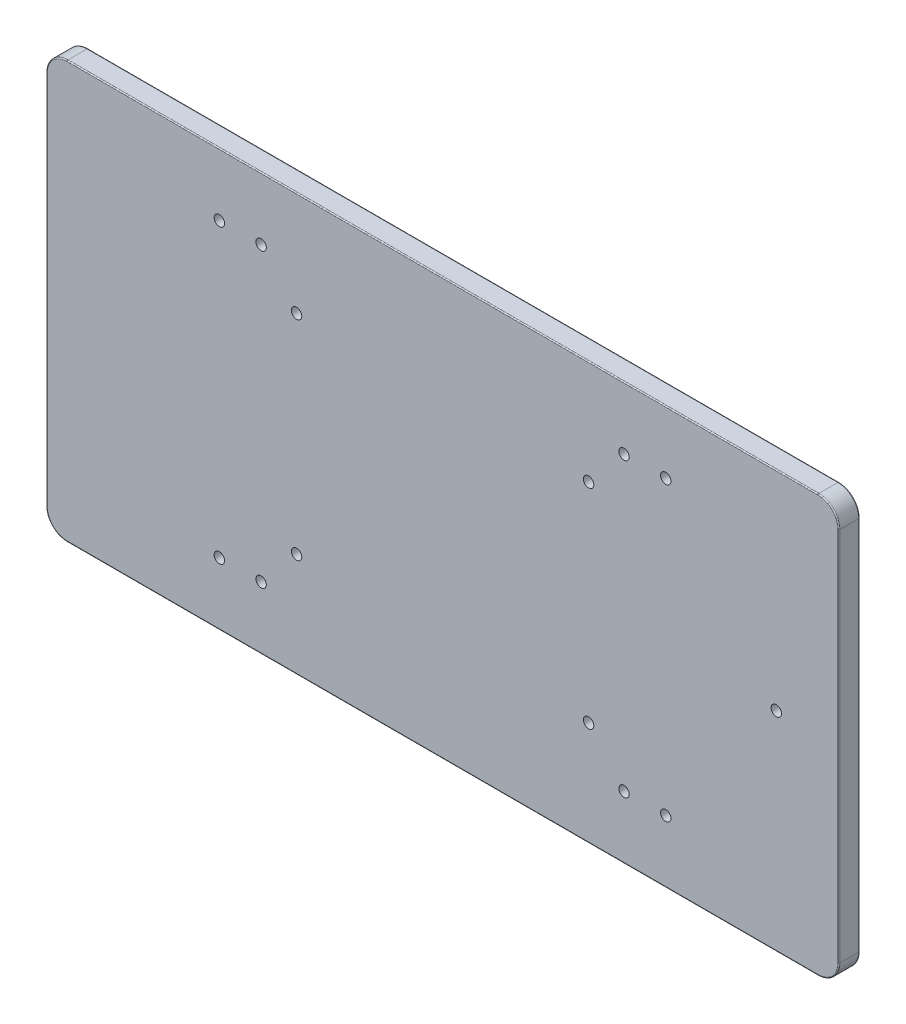
ISO-10303-21;
HEADER;
FILE_DESCRIPTION(('STEP AP214'),'2;1');
FILE_NAME('part.step','',(''),(''),'','','');
FILE_SCHEMA(('AUTOMOTIVE_DESIGN { 1 0 10303 214 1 1 1 1 }'));
ENDSEC;
DATA;
#1=APPLICATION_CONTEXT('core data for automotive mechanical design processes');
#2=APPLICATION_PROTOCOL_DEFINITION('international standard','automotive_design',2000,#1);
#3=PRODUCT_CONTEXT('',#1,'mechanical');
#4=PRODUCT('Part','Part','',(#3));
#5=PRODUCT_RELATED_PRODUCT_CATEGORY('part','',(#4));
#6=PRODUCT_DEFINITION_FORMATION('','',#4);
#7=PRODUCT_DEFINITION_CONTEXT('part definition',#1,'design');
#8=PRODUCT_DEFINITION('design','',#6,#7);
#9=PRODUCT_DEFINITION_SHAPE('','',#8);
#10=(LENGTH_UNIT() NAMED_UNIT(*) SI_UNIT(.MILLI.,.METRE.));
#11=(NAMED_UNIT(*) PLANE_ANGLE_UNIT() SI_UNIT($,.RADIAN.));
#12=(NAMED_UNIT(*) SI_UNIT($,.STERADIAN.) SOLID_ANGLE_UNIT());
#13=UNCERTAINTY_MEASURE_WITH_UNIT(LENGTH_MEASURE(1.E-05),#10,'distance_accuracy_value','');
#14=(GEOMETRIC_REPRESENTATION_CONTEXT(3) GLOBAL_UNCERTAINTY_ASSIGNED_CONTEXT((#13)) GLOBAL_UNIT_ASSIGNED_CONTEXT((#10,
#11,#12)) REPRESENTATION_CONTEXT('',''));
#15=CARTESIAN_POINT('',(0.,0.,0.));
#16=DIRECTION('',(0.,0.,1.));
#17=DIRECTION('',(1.,0.,0.));
#18=AXIS2_PLACEMENT_3D('',#15,#16,#17);
#19=CARTESIAN_POINT('',(0.,0.,5.));
#20=DIRECTION('',(0.,0.,-1.));
#21=DIRECTION('',(-1.,0.,0.));
#22=AXIS2_PLACEMENT_3D('',#19,#20,#21);
#23=PLANE('',#22);
#24=DIRECTION('',(0.,-1.,0.));
#25=VECTOR('',#24,1.);
#26=CARTESIAN_POINT('',(-94.75,0.,5.));
#27=LINE('',#26,#25);
#28=CARTESIAN_POINT('',(-94.75,45.,5.));
#29=VERTEX_POINT('',#28);
#30=CARTESIAN_POINT('',(-94.75,-45.,5.));
#31=VERTEX_POINT('',#30);
#32=EDGE_CURVE('E54',#29,#31,#27,.T.);
#33=ORIENTED_EDGE('',*,*,#32,.T.);
#34=CARTESIAN_POINT('',(-90.,-45.,5.));
#35=DIRECTION('',(0.,0.,-1.));
#36=DIRECTION('',(-1.,0.,0.));
#37=AXIS2_PLACEMENT_3D('',#34,#35,#36);
#38=CIRCLE('',#37,4.75);
#39=CARTESIAN_POINT('',(-90.,-49.75,5.));
#40=VERTEX_POINT('',#39);
#41=EDGE_CURVE('E236',#31,#40,#38,.F.);
#42=ORIENTED_EDGE('',*,*,#41,.T.);
#43=DIRECTION('',(1.,0.,0.));
#44=VECTOR('',#43,1.);
#45=CARTESIAN_POINT('',(0.,-49.75,5.));
#46=LINE('',#45,#44);
#47=CARTESIAN_POINT('',(90.,-49.75,5.));
#48=VERTEX_POINT('',#47);
#49=EDGE_CURVE('E224',#40,#48,#46,.T.);
#50=ORIENTED_EDGE('',*,*,#49,.T.);
#51=CARTESIAN_POINT('',(90.,-45.,5.));
#52=DIRECTION('',(0.,0.,-1.));
#53=DIRECTION('',(-1.,0.,0.));
#54=AXIS2_PLACEMENT_3D('',#51,#52,#53);
#55=CIRCLE('',#54,4.75);
#56=CARTESIAN_POINT('',(94.75,-45.,5.));
#57=VERTEX_POINT('',#56);
#58=EDGE_CURVE('E226',#48,#57,#55,.F.);
#59=ORIENTED_EDGE('',*,*,#58,.T.);
#60=DIRECTION('',(0.,1.,0.));
#61=VECTOR('',#60,1.);
#62=CARTESIAN_POINT('',(94.75,0.,5.));
#63=LINE('',#62,#61);
#64=CARTESIAN_POINT('',(94.75,45.,5.));
#65=VERTEX_POINT('',#64);
#66=EDGE_CURVE('E228',#57,#65,#63,.T.);
#67=ORIENTED_EDGE('',*,*,#66,.T.);
#68=CARTESIAN_POINT('',(90.,45.,5.));
#69=DIRECTION('',(0.,0.,-1.));
#70=DIRECTION('',(-1.,0.,0.));
#71=AXIS2_PLACEMENT_3D('',#68,#69,#70);
#72=CIRCLE('',#71,4.75);
#73=CARTESIAN_POINT('',(90.,49.75,5.));
#74=VERTEX_POINT('',#73);
#75=EDGE_CURVE('E230',#65,#74,#72,.F.);
#76=ORIENTED_EDGE('',*,*,#75,.T.);
#77=DIRECTION('',(-1.,0.,0.));
#78=VECTOR('',#77,1.);
#79=CARTESIAN_POINT('',(0.,49.75,5.));
#80=LINE('',#79,#78);
#81=CARTESIAN_POINT('',(-90.,49.75,5.));
#82=VERTEX_POINT('',#81);
#83=EDGE_CURVE('E232',#74,#82,#80,.T.);
#84=ORIENTED_EDGE('',*,*,#83,.T.);
#85=CARTESIAN_POINT('',(-90.,45.,5.));
#86=DIRECTION('',(0.,0.,-1.));
#87=DIRECTION('',(-1.,0.,0.));
#88=AXIS2_PLACEMENT_3D('',#85,#86,#87);
#89=CIRCLE('',#88,4.75);
#90=EDGE_CURVE('E59',#82,#29,#89,.F.);
#91=ORIENTED_EDGE('',*,*,#90,.T.);
#92=EDGE_LOOP('',(#33,#42,#50,#59,#67,#76,#84,#91));
#93=FACE_BOUND('',#92,.T.);
#94=CARTESIAN_POINT('',(-43.5,-35.,5.));
#95=DIRECTION('',(0.,0.,1.));
#96=DIRECTION('',(1.,0.,0.));
#97=AXIS2_PLACEMENT_3D('',#94,#95,#96);
#98=CIRCLE('',#97,1.25);
#99=CARTESIAN_POINT('',(-42.25,-35.,5.));
#100=VERTEX_POINT('',#99);
#101=EDGE_CURVE('E359',#100,#100,#98,.T.);
#102=ORIENTED_EDGE('',*,*,#101,.F.);
#103=EDGE_LOOP('',(#102));
#104=FACE_BOUND('',#103,.T.);
#105=CARTESIAN_POINT('',(-53.5,-35.,5.));
#106=DIRECTION('',(0.,0.,1.));
#107=DIRECTION('',(1.,0.,0.));
#108=AXIS2_PLACEMENT_3D('',#105,#106,#107);
#109=CIRCLE('',#108,1.25);
#110=CARTESIAN_POINT('',(-52.25,-35.,5.));
#111=VERTEX_POINT('',#110);
#112=EDGE_CURVE('E366',#111,#111,#109,.T.);
#113=ORIENTED_EDGE('',*,*,#112,.F.);
#114=EDGE_LOOP('',(#113));
#115=FACE_BOUND('',#114,.T.);
#116=CARTESIAN_POINT('',(-35.,25.,5.));
#117=DIRECTION('',(0.,0.,1.));
#118=DIRECTION('',(1.,0.,0.));
#119=AXIS2_PLACEMENT_3D('',#116,#117,#118);
#120=CIRCLE('',#119,1.25);
#121=CARTESIAN_POINT('',(-33.75,25.,5.));
#122=VERTEX_POINT('',#121);
#123=EDGE_CURVE('E371',#122,#122,#120,.T.);
#124=ORIENTED_EDGE('',*,*,#123,.F.);
#125=EDGE_LOOP('',(#124));
#126=FACE_BOUND('',#125,.T.);
#127=CARTESIAN_POINT('',(35.,25.,5.));
#128=DIRECTION('',(0.,0.,1.));
#129=DIRECTION('',(1.,0.,0.));
#130=AXIS2_PLACEMENT_3D('',#127,#128,#129);
#131=CIRCLE('',#130,1.25);
#132=CARTESIAN_POINT('',(36.25,25.,5.));
#133=VERTEX_POINT('',#132);
#134=EDGE_CURVE('E377',#133,#133,#131,.T.);
#135=ORIENTED_EDGE('',*,*,#134,.F.);
#136=EDGE_LOOP('',(#135));
#137=FACE_BOUND('',#136,.T.);
#138=CARTESIAN_POINT('',(35.,-25.,5.));
#139=DIRECTION('',(0.,0.,1.));
#140=DIRECTION('',(1.,0.,0.));
#141=AXIS2_PLACEMENT_3D('',#138,#139,#140);
#142=CIRCLE('',#141,1.25);
#143=CARTESIAN_POINT('',(36.25,-25.,5.));
#144=VERTEX_POINT('',#143);
#145=EDGE_CURVE('E383',#144,#144,#142,.T.);
#146=ORIENTED_EDGE('',*,*,#145,.F.);
#147=EDGE_LOOP('',(#146));
#148=FACE_BOUND('',#147,.T.);
#149=CARTESIAN_POINT('',(-35.,-25.,5.));
#150=DIRECTION('',(0.,0.,1.));
#151=DIRECTION('',(1.,0.,0.));
#152=AXIS2_PLACEMENT_3D('',#149,#150,#151);
#153=CIRCLE('',#152,1.25);
#154=CARTESIAN_POINT('',(-33.75,-25.,5.));
#155=VERTEX_POINT('',#154);
#156=EDGE_CURVE('E389',#155,#155,#153,.T.);
#157=ORIENTED_EDGE('',*,*,#156,.F.);
#158=EDGE_LOOP('',(#157));
#159=FACE_BOUND('',#158,.T.);
#160=CARTESIAN_POINT('',(43.4999999999999,-35.0000000000001,5.));
#161=DIRECTION('',(0.,0.,1.));
#162=DIRECTION('',(-1.,0.,0.));
#163=AXIS2_PLACEMENT_3D('',#160,#161,#162);
#164=CIRCLE('',#163,1.24999999999998);
#165=CARTESIAN_POINT('',(42.2499999999999,-35.0000000000001,5.));
#166=VERTEX_POINT('',#165);
#167=EDGE_CURVE('E395',#166,#166,#164,.T.);
#168=ORIENTED_EDGE('',*,*,#167,.F.);
#169=EDGE_LOOP('',(#168));
#170=FACE_BOUND('',#169,.T.);
#171=CARTESIAN_POINT('',(53.4999999999999,-35.0000000000001,5.));
#172=DIRECTION('',(0.,0.,1.));
#173=DIRECTION('',(-1.,0.,0.));
#174=AXIS2_PLACEMENT_3D('',#171,#172,#173);
#175=CIRCLE('',#174,1.24999999999999);
#176=CARTESIAN_POINT('',(52.2499999999999,-35.0000000000001,5.));
#177=VERTEX_POINT('',#176);
#178=EDGE_CURVE('E401',#177,#177,#175,.T.);
#179=ORIENTED_EDGE('',*,*,#178,.F.);
#180=EDGE_LOOP('',(#179));
#181=FACE_BOUND('',#180,.T.);
#182=CARTESIAN_POINT('',(53.4999999999999,35.0000000000001,5.));
#183=DIRECTION('',(0.,0.,1.));
#184=DIRECTION('',(1.,0.,0.));
#185=AXIS2_PLACEMENT_3D('',#182,#183,#184);
#186=CIRCLE('',#185,1.24999999999999);
#187=CARTESIAN_POINT('',(54.7499999999999,35.0000000000001,5.));
#188=VERTEX_POINT('',#187);
#189=EDGE_CURVE('E407',#188,#188,#186,.T.);
#190=ORIENTED_EDGE('',*,*,#189,.F.);
#191=EDGE_LOOP('',(#190));
#192=FACE_BOUND('',#191,.T.);
#193=CARTESIAN_POINT('',(43.4999999999999,35.0000000000001,5.));
#194=DIRECTION('',(0.,0.,1.));
#195=DIRECTION('',(1.,0.,0.));
#196=AXIS2_PLACEMENT_3D('',#193,#194,#195);
#197=CIRCLE('',#196,1.24999999999998);
#198=CARTESIAN_POINT('',(44.7499999999999,35.0000000000001,5.));
#199=VERTEX_POINT('',#198);
#200=EDGE_CURVE('E413',#199,#199,#197,.T.);
#201=ORIENTED_EDGE('',*,*,#200,.F.);
#202=EDGE_LOOP('',(#201));
#203=FACE_BOUND('',#202,.T.);
#204=CARTESIAN_POINT('',(-53.4999999999999,35.0000000000001,5.));
#205=DIRECTION('',(0.,0.,1.));
#206=DIRECTION('',(-1.,0.,0.));
#207=AXIS2_PLACEMENT_3D('',#204,#205,#206);
#208=CIRCLE('',#207,1.24999999999998);
#209=CARTESIAN_POINT('',(-54.7499999999999,35.0000000000001,5.));
#210=VERTEX_POINT('',#209);
#211=EDGE_CURVE('E419',#210,#210,#208,.T.);
#212=ORIENTED_EDGE('',*,*,#211,.F.);
#213=EDGE_LOOP('',(#212));
#214=FACE_BOUND('',#213,.T.);
#215=CARTESIAN_POINT('',(-43.4999999999999,35.0000000000001,5.));
#216=DIRECTION('',(0.,0.,1.));
#217=DIRECTION('',(-1.,0.,0.));
#218=AXIS2_PLACEMENT_3D('',#215,#216,#217);
#219=CIRCLE('',#218,1.24999999999997);
#220=CARTESIAN_POINT('',(-44.7499999999999,35.0000000000001,5.));
#221=VERTEX_POINT('',#220);
#222=EDGE_CURVE('E425',#221,#221,#219,.T.);
#223=ORIENTED_EDGE('',*,*,#222,.F.);
#224=EDGE_LOOP('',(#223));
#225=FACE_BOUND('',#224,.T.);
#226=CARTESIAN_POINT('',(80.,0.,5.));
#227=DIRECTION('',(0.,0.,1.));
#228=DIRECTION('',(1.,0.,0.));
#229=AXIS2_PLACEMENT_3D('',#226,#227,#228);
#230=CIRCLE('',#229,1.25);
#231=CARTESIAN_POINT('',(81.25,0.,5.));
#232=VERTEX_POINT('',#231);
#233=EDGE_CURVE('E431',#232,#232,#230,.T.);
#234=ORIENTED_EDGE('',*,*,#233,.F.);
#235=EDGE_LOOP('',(#234));
#236=FACE_BOUND('',#235,.T.);
#237=ADVANCED_FACE('F37',(#93,#104,#115,#126,#137,#148,#159,#170,#181,#192,#203,#214,#225,#236),
#23,.F.);
#238=CARTESIAN_POINT('',(0.,0.,0.));
#239=DIRECTION('',(0.,0.,-1.));
#240=DIRECTION('',(-1.,0.,0.));
#241=AXIS2_PLACEMENT_3D('',#238,#239,#240);
#242=PLANE('',#241);
#243=DIRECTION('',(1.,0.,0.));
#244=VECTOR('',#243,1.);
#245=CARTESIAN_POINT('',(-90.,-49.75,0.));
#246=LINE('',#245,#244);
#247=CARTESIAN_POINT('',(90.,-49.75,0.));
#248=VERTEX_POINT('',#247);
#249=CARTESIAN_POINT('',(-90.,-49.75,0.));
#250=VERTEX_POINT('',#249);
#251=EDGE_CURVE('E156',#248,#250,#246,.F.);
#252=ORIENTED_EDGE('',*,*,#251,.T.);
#253=CARTESIAN_POINT('',(-90.,-45.,0.));
#254=DIRECTION('',(0.,0.,-1.));
#255=DIRECTION('',(-1.,0.,0.));
#256=AXIS2_PLACEMENT_3D('',#253,#254,#255);
#257=CIRCLE('',#256,4.75);
#258=CARTESIAN_POINT('',(-94.75,-45.,0.));
#259=VERTEX_POINT('',#258);
#260=EDGE_CURVE('E193',#250,#259,#257,.T.);
#261=ORIENTED_EDGE('',*,*,#260,.T.);
#262=DIRECTION('',(0.,-1.,0.));
#263=VECTOR('',#262,1.);
#264=CARTESIAN_POINT('',(-94.75,45.,0.));
#265=LINE('',#264,#263);
#266=CARTESIAN_POINT('',(-94.75,45.,0.));
#267=VERTEX_POINT('',#266);
#268=EDGE_CURVE('E191',#259,#267,#265,.F.);
#269=ORIENTED_EDGE('',*,*,#268,.T.);
#270=CARTESIAN_POINT('',(-90.,45.,0.));
#271=DIRECTION('',(0.,0.,-1.));
#272=DIRECTION('',(-1.,0.,0.));
#273=AXIS2_PLACEMENT_3D('',#270,#271,#272);
#274=CIRCLE('',#273,4.75);
#275=CARTESIAN_POINT('',(-90.,49.75,0.));
#276=VERTEX_POINT('',#275);
#277=EDGE_CURVE('E189',#267,#276,#274,.T.);
#278=ORIENTED_EDGE('',*,*,#277,.T.);
#279=DIRECTION('',(-1.,0.,0.));
#280=VECTOR('',#279,1.);
#281=CARTESIAN_POINT('',(90.,49.75,0.));
#282=LINE('',#281,#280);
#283=CARTESIAN_POINT('',(90.,49.75,0.));
#284=VERTEX_POINT('',#283);
#285=EDGE_CURVE('E187',#276,#284,#282,.F.);
#286=ORIENTED_EDGE('',*,*,#285,.T.);
#287=CARTESIAN_POINT('',(90.,45.,0.));
#288=DIRECTION('',(0.,0.,-1.));
#289=DIRECTION('',(-1.,0.,0.));
#290=AXIS2_PLACEMENT_3D('',#287,#288,#289);
#291=CIRCLE('',#290,4.75);
#292=CARTESIAN_POINT('',(94.75,45.,0.));
#293=VERTEX_POINT('',#292);
#294=EDGE_CURVE('E185',#284,#293,#291,.T.);
#295=ORIENTED_EDGE('',*,*,#294,.T.);
#296=DIRECTION('',(0.,1.,0.));
#297=VECTOR('',#296,1.);
#298=CARTESIAN_POINT('',(94.75,-45.,0.));
#299=LINE('',#298,#297);
#300=CARTESIAN_POINT('',(94.75,-45.,0.));
#301=VERTEX_POINT('',#300);
#302=EDGE_CURVE('E159',#293,#301,#299,.F.);
#303=ORIENTED_EDGE('',*,*,#302,.T.);
#304=CARTESIAN_POINT('',(90.,-45.,0.));
#305=DIRECTION('',(0.,0.,-1.));
#306=DIRECTION('',(-1.,0.,0.));
#307=AXIS2_PLACEMENT_3D('',#304,#305,#306);
#308=CIRCLE('',#307,4.75);
#309=EDGE_CURVE('E150',#301,#248,#308,.T.);
#310=ORIENTED_EDGE('',*,*,#309,.T.);
#311=EDGE_LOOP('',(#252,#261,#269,#278,#286,#295,#303,#310));
#312=FACE_BOUND('',#311,.T.);
#313=CARTESIAN_POINT('',(-43.4999999999999,35.0000000000001,0.));
#314=DIRECTION('',(0.,0.,1.));
#315=DIRECTION('',(-1.,0.,0.));
#316=AXIS2_PLACEMENT_3D('',#313,#314,#315);
#317=CIRCLE('',#316,1.24999999999997);
#318=CARTESIAN_POINT('',(-44.7499999999999,35.0000000000001,0.));
#319=VERTEX_POINT('',#318);
#320=EDGE_CURVE('E428',#319,#319,#317,.T.);
#321=ORIENTED_EDGE('',*,*,#320,.T.);
#322=EDGE_LOOP('',(#321));
#323=FACE_BOUND('',#322,.T.);
#324=CARTESIAN_POINT('',(43.4999999999999,35.0000000000001,0.));
#325=DIRECTION('',(0.,0.,1.));
#326=DIRECTION('',(1.,0.,0.));
#327=AXIS2_PLACEMENT_3D('',#324,#325,#326);
#328=CIRCLE('',#327,1.24999999999998);
#329=CARTESIAN_POINT('',(44.7499999999999,35.0000000000001,0.));
#330=VERTEX_POINT('',#329);
#331=EDGE_CURVE('E416',#330,#330,#328,.T.);
#332=ORIENTED_EDGE('',*,*,#331,.T.);
#333=EDGE_LOOP('',(#332));
#334=FACE_BOUND('',#333,.T.);
#335=CARTESIAN_POINT('',(53.4999999999999,-35.0000000000001,0.));
#336=DIRECTION('',(0.,0.,1.));
#337=DIRECTION('',(-1.,0.,0.));
#338=AXIS2_PLACEMENT_3D('',#335,#336,#337);
#339=CIRCLE('',#338,1.24999999999999);
#340=CARTESIAN_POINT('',(52.2499999999999,-35.0000000000001,0.));
#341=VERTEX_POINT('',#340);
#342=EDGE_CURVE('E404',#341,#341,#339,.T.);
#343=ORIENTED_EDGE('',*,*,#342,.T.);
#344=EDGE_LOOP('',(#343));
#345=FACE_BOUND('',#344,.T.);
#346=CARTESIAN_POINT('',(-35.,-25.,0.));
#347=DIRECTION('',(0.,0.,1.));
#348=DIRECTION('',(1.,0.,0.));
#349=AXIS2_PLACEMENT_3D('',#346,#347,#348);
#350=CIRCLE('',#349,1.25);
#351=CARTESIAN_POINT('',(-33.75,-25.,0.));
#352=VERTEX_POINT('',#351);
#353=EDGE_CURVE('E392',#352,#352,#350,.T.);
#354=ORIENTED_EDGE('',*,*,#353,.T.);
#355=EDGE_LOOP('',(#354));
#356=FACE_BOUND('',#355,.T.);
#357=CARTESIAN_POINT('',(35.,25.,0.));
#358=DIRECTION('',(0.,0.,1.));
#359=DIRECTION('',(1.,0.,0.));
#360=AXIS2_PLACEMENT_3D('',#357,#358,#359);
#361=CIRCLE('',#360,1.25);
#362=CARTESIAN_POINT('',(36.25,25.,0.));
#363=VERTEX_POINT('',#362);
#364=EDGE_CURVE('E380',#363,#363,#361,.T.);
#365=ORIENTED_EDGE('',*,*,#364,.T.);
#366=EDGE_LOOP('',(#365));
#367=FACE_BOUND('',#366,.T.);
#368=CARTESIAN_POINT('',(-53.5,-35.,0.));
#369=DIRECTION('',(0.,0.,1.));
#370=DIRECTION('',(1.,0.,0.));
#371=AXIS2_PLACEMENT_3D('',#368,#369,#370);
#372=CIRCLE('',#371,1.25);
#373=CARTESIAN_POINT('',(-52.25,-35.,0.));
#374=VERTEX_POINT('',#373);
#375=EDGE_CURVE('E368',#374,#374,#372,.T.);
#376=ORIENTED_EDGE('',*,*,#375,.T.);
#377=EDGE_LOOP('',(#376));
#378=FACE_BOUND('',#377,.T.);
#379=CARTESIAN_POINT('',(-43.5,-35.,0.));
#380=DIRECTION('',(0.,0.,1.));
#381=DIRECTION('',(1.,0.,0.));
#382=AXIS2_PLACEMENT_3D('',#379,#380,#381);
#383=CIRCLE('',#382,1.25);
#384=CARTESIAN_POINT('',(-42.25,-35.,0.));
#385=VERTEX_POINT('',#384);
#386=EDGE_CURVE('E362',#385,#385,#383,.T.);
#387=ORIENTED_EDGE('',*,*,#386,.T.);
#388=EDGE_LOOP('',(#387));
#389=FACE_BOUND('',#388,.T.);
#390=CARTESIAN_POINT('',(-35.,25.,0.));
#391=DIRECTION('',(0.,0.,1.));
#392=DIRECTION('',(1.,0.,0.));
#393=AXIS2_PLACEMENT_3D('',#390,#391,#392);
#394=CIRCLE('',#393,1.25);
#395=CARTESIAN_POINT('',(-33.75,25.,0.));
#396=VERTEX_POINT('',#395);
#397=EDGE_CURVE('E374',#396,#396,#394,.T.);
#398=ORIENTED_EDGE('',*,*,#397,.T.);
#399=EDGE_LOOP('',(#398));
#400=FACE_BOUND('',#399,.T.);
#401=CARTESIAN_POINT('',(35.,-25.,0.));
#402=DIRECTION('',(0.,0.,1.));
#403=DIRECTION('',(1.,0.,0.));
#404=AXIS2_PLACEMENT_3D('',#401,#402,#403);
#405=CIRCLE('',#404,1.25);
#406=CARTESIAN_POINT('',(36.25,-25.,0.));
#407=VERTEX_POINT('',#406);
#408=EDGE_CURVE('E386',#407,#407,#405,.T.);
#409=ORIENTED_EDGE('',*,*,#408,.T.);
#410=EDGE_LOOP('',(#409));
#411=FACE_BOUND('',#410,.T.);
#412=CARTESIAN_POINT('',(43.4999999999999,-35.0000000000001,0.));
#413=DIRECTION('',(0.,0.,1.));
#414=DIRECTION('',(-1.,0.,0.));
#415=AXIS2_PLACEMENT_3D('',#412,#413,#414);
#416=CIRCLE('',#415,1.24999999999998);
#417=CARTESIAN_POINT('',(42.2499999999999,-35.0000000000001,0.));
#418=VERTEX_POINT('',#417);
#419=EDGE_CURVE('E398',#418,#418,#416,.T.);
#420=ORIENTED_EDGE('',*,*,#419,.T.);
#421=EDGE_LOOP('',(#420));
#422=FACE_BOUND('',#421,.T.);
#423=CARTESIAN_POINT('',(53.4999999999999,35.0000000000001,0.));
#424=DIRECTION('',(0.,0.,1.));
#425=DIRECTION('',(1.,0.,0.));
#426=AXIS2_PLACEMENT_3D('',#423,#424,#425);
#427=CIRCLE('',#426,1.24999999999999);
#428=CARTESIAN_POINT('',(54.7499999999999,35.0000000000001,0.));
#429=VERTEX_POINT('',#428);
#430=EDGE_CURVE('E410',#429,#429,#427,.T.);
#431=ORIENTED_EDGE('',*,*,#430,.T.);
#432=EDGE_LOOP('',(#431));
#433=FACE_BOUND('',#432,.T.);
#434=CARTESIAN_POINT('',(-53.4999999999999,35.0000000000001,0.));
#435=DIRECTION('',(0.,0.,1.));
#436=DIRECTION('',(-1.,0.,0.));
#437=AXIS2_PLACEMENT_3D('',#434,#435,#436);
#438=CIRCLE('',#437,1.24999999999998);
#439=CARTESIAN_POINT('',(-54.7499999999999,35.0000000000001,0.));
#440=VERTEX_POINT('',#439);
#441=EDGE_CURVE('E422',#440,#440,#438,.T.);
#442=ORIENTED_EDGE('',*,*,#441,.T.);
#443=EDGE_LOOP('',(#442));
#444=FACE_BOUND('',#443,.T.);
#445=CARTESIAN_POINT('',(80.,0.,0.));
#446=DIRECTION('',(0.,0.,1.));
#447=DIRECTION('',(1.,0.,0.));
#448=AXIS2_PLACEMENT_3D('',#445,#446,#447);
#449=CIRCLE('',#448,1.25);
#450=CARTESIAN_POINT('',(81.25,0.,0.));
#451=VERTEX_POINT('',#450);
#452=EDGE_CURVE('E254',#451,#451,#449,.T.);
#453=ORIENTED_EDGE('',*,*,#452,.T.);
#454=EDGE_LOOP('',(#453));
#455=FACE_BOUND('',#454,.T.);
#456=ADVANCED_FACE('F152',(#312,#323,#334,#345,#356,#367,#378,#389,#400,#411,#422,#433,#444,
#455),#242,.T.);
#457=CARTESIAN_POINT('',(-95.,50.,5.));
#458=DIRECTION('',(1.,0.,0.));
#459=DIRECTION('',(0.,1.,0.));
#460=AXIS2_PLACEMENT_3D('',#457,#458,#459);
#461=PLANE('',#460);
#462=DIRECTION('',(0.,0.,-1.));
#463=VECTOR('',#462,1.);
#464=CARTESIAN_POINT('',(-95.,45.,5.));
#465=LINE('',#464,#463);
#466=CARTESIAN_POINT('',(-95.,45.,4.75));
#467=VERTEX_POINT('',#466);
#468=CARTESIAN_POINT('',(-95.,45.,0.25));
#469=VERTEX_POINT('',#468);
#470=EDGE_CURVE('E180',#467,#469,#465,.T.);
#471=ORIENTED_EDGE('',*,*,#470,.T.);
#472=DIRECTION('',(0.,-1.,0.));
#473=VECTOR('',#472,1.);
#474=CARTESIAN_POINT('',(-95.,-45.,0.25));
#475=LINE('',#474,#473);
#476=CARTESIAN_POINT('',(-95.,-45.,0.25));
#477=VERTEX_POINT('',#476);
#478=EDGE_CURVE('E203',#469,#477,#475,.T.);
#479=ORIENTED_EDGE('',*,*,#478,.T.);
#480=DIRECTION('',(0.,0.,-1.));
#481=VECTOR('',#480,1.);
#482=CARTESIAN_POINT('',(-95.,-45.,5.));
#483=LINE('',#482,#481);
#484=CARTESIAN_POINT('',(-95.,-45.,4.75));
#485=VERTEX_POINT('',#484);
#486=EDGE_CURVE('E177',#477,#485,#483,.F.);
#487=ORIENTED_EDGE('',*,*,#486,.T.);
#488=DIRECTION('',(0.,-1.,0.));
#489=VECTOR('',#488,1.);
#490=CARTESIAN_POINT('',(-95.,50.,4.75));
#491=LINE('',#490,#489);
#492=EDGE_CURVE('E201',#485,#467,#491,.F.);
#493=ORIENTED_EDGE('',*,*,#492,.T.);
#494=EDGE_LOOP('',(#471,#479,#487,#493));
#495=FACE_BOUND('',#494,.T.);
#496=ADVANCED_FACE('F314',(#495),#461,.F.);
#497=CARTESIAN_POINT('',(95.,-50.,5.));
#498=DIRECTION('',(0.,1.,0.));
#499=DIRECTION('',(-1.,0.,0.));
#500=AXIS2_PLACEMENT_3D('',#497,#498,#499);
#501=PLANE('',#500);
#502=DIRECTION('',(0.,0.,-1.));
#503=VECTOR('',#502,1.);
#504=CARTESIAN_POINT('',(-90.,-50.,5.));
#505=LINE('',#504,#503);
#506=CARTESIAN_POINT('',(-90.,-50.,4.75));
#507=VERTEX_POINT('',#506);
#508=CARTESIAN_POINT('',(-90.,-50.,0.25));
#509=VERTEX_POINT('',#508);
#510=EDGE_CURVE('E300',#507,#509,#505,.T.);
#511=ORIENTED_EDGE('',*,*,#510,.T.);
#512=DIRECTION('',(1.,0.,0.));
#513=VECTOR('',#512,1.);
#514=CARTESIAN_POINT('',(90.,-50.,0.25));
#515=LINE('',#514,#513);
#516=CARTESIAN_POINT('',(90.,-50.,0.25));
#517=VERTEX_POINT('',#516);
#518=EDGE_CURVE('E11',#509,#517,#515,.T.);
#519=ORIENTED_EDGE('',*,*,#518,.T.);
#520=DIRECTION('',(0.,0.,-1.));
#521=VECTOR('',#520,1.);
#522=CARTESIAN_POINT('',(90.,-50.,5.));
#523=LINE('',#522,#521);
#524=CARTESIAN_POINT('',(90.,-50.,4.75));
#525=VERTEX_POINT('',#524);
#526=EDGE_CURVE('E304',#517,#525,#523,.F.);
#527=ORIENTED_EDGE('',*,*,#526,.T.);
#528=DIRECTION('',(1.,0.,0.));
#529=VECTOR('',#528,1.);
#530=CARTESIAN_POINT('',(95.,-50.,4.75));
#531=LINE('',#530,#529);
#532=EDGE_CURVE('E46',#525,#507,#531,.F.);
#533=ORIENTED_EDGE('',*,*,#532,.T.);
#534=EDGE_LOOP('',(#511,#519,#527,#533));
#535=FACE_BOUND('',#534,.T.);
#536=ADVANCED_FACE('F336',(#535),#501,.F.);
#537=CARTESIAN_POINT('',(95.,50.,5.));
#538=DIRECTION('',(-1.,0.,0.));
#539=DIRECTION('',(0.,-1.,0.));
#540=AXIS2_PLACEMENT_3D('',#537,#538,#539);
#541=PLANE('',#540);
#542=DIRECTION('',(0.,0.,-1.));
#543=VECTOR('',#542,1.);
#544=CARTESIAN_POINT('',(95.,-45.,5.));
#545=LINE('',#544,#543);
#546=CARTESIAN_POINT('',(95.,-45.,4.75));
#547=VERTEX_POINT('',#546);
#548=CARTESIAN_POINT('',(95.,-45.,0.25));
#549=VERTEX_POINT('',#548);
#550=EDGE_CURVE('E301',#547,#549,#545,.T.);
#551=ORIENTED_EDGE('',*,*,#550,.T.);
#552=DIRECTION('',(0.,1.,0.));
#553=VECTOR('',#552,1.);
#554=CARTESIAN_POINT('',(95.,45.,0.25));
#555=LINE('',#554,#553);
#556=CARTESIAN_POINT('',(95.,45.,0.25));
#557=VERTEX_POINT('',#556);
#558=EDGE_CURVE('E219',#549,#557,#555,.T.);
#559=ORIENTED_EDGE('',*,*,#558,.T.);
#560=DIRECTION('',(0.,0.,-1.));
#561=VECTOR('',#560,1.);
#562=CARTESIAN_POINT('',(95.,45.,5.));
#563=LINE('',#562,#561);
#564=CARTESIAN_POINT('',(95.,45.,4.75));
#565=VERTEX_POINT('',#564);
#566=EDGE_CURVE('E291',#557,#565,#563,.F.);
#567=ORIENTED_EDGE('',*,*,#566,.T.);
#568=DIRECTION('',(0.,1.,0.));
#569=VECTOR('',#568,1.);
#570=CARTESIAN_POINT('',(95.,50.,4.75));
#571=LINE('',#570,#569);
#572=EDGE_CURVE('E217',#565,#547,#571,.F.);
#573=ORIENTED_EDGE('',*,*,#572,.T.);
#574=EDGE_LOOP('',(#551,#559,#567,#573));
#575=FACE_BOUND('',#574,.T.);
#576=ADVANCED_FACE('F297',(#575),#541,.F.);
#577=CARTESIAN_POINT('',(95.,50.,5.));
#578=DIRECTION('',(0.,-1.,0.));
#579=DIRECTION('',(1.,0.,0.));
#580=AXIS2_PLACEMENT_3D('',#577,#578,#579);
#581=PLANE('',#580);
#582=DIRECTION('',(0.,0.,-1.));
#583=VECTOR('',#582,1.);
#584=CARTESIAN_POINT('',(90.,50.,5.));
#585=LINE('',#584,#583);
#586=CARTESIAN_POINT('',(90.,50.,4.75));
#587=VERTEX_POINT('',#586);
#588=CARTESIAN_POINT('',(90.,50.,0.25));
#589=VERTEX_POINT('',#588);
#590=EDGE_CURVE('E294',#587,#589,#585,.T.);
#591=ORIENTED_EDGE('',*,*,#590,.T.);
#592=DIRECTION('',(-1.,0.,0.));
#593=VECTOR('',#592,1.);
#594=CARTESIAN_POINT('',(-90.,50.,0.25));
#595=LINE('',#594,#593);
#596=CARTESIAN_POINT('',(-90.,50.,0.25));
#597=VERTEX_POINT('',#596);
#598=EDGE_CURVE('E211',#589,#597,#595,.T.);
#599=ORIENTED_EDGE('',*,*,#598,.T.);
#600=DIRECTION('',(0.,0.,-1.));
#601=VECTOR('',#600,1.);
#602=CARTESIAN_POINT('',(-90.,50.,5.));
#603=LINE('',#602,#601);
#604=CARTESIAN_POINT('',(-90.,50.,4.75));
#605=VERTEX_POINT('',#604);
#606=EDGE_CURVE('E354',#597,#605,#603,.F.);
#607=ORIENTED_EDGE('',*,*,#606,.T.);
#608=DIRECTION('',(-1.,0.,0.));
#609=VECTOR('',#608,1.);
#610=CARTESIAN_POINT('',(95.,50.,4.75));
#611=LINE('',#610,#609);
#612=EDGE_CURVE('E209',#605,#587,#611,.F.);
#613=ORIENTED_EDGE('',*,*,#612,.T.);
#614=EDGE_LOOP('',(#591,#599,#607,#613));
#615=FACE_BOUND('',#614,.T.);
#616=ADVANCED_FACE('F357',(#615),#581,.F.);
#617=CARTESIAN_POINT('',(-43.5,-35.,5.));
#618=DIRECTION('',(0.,0.,-1.));
#619=DIRECTION('',(-1.,0.,0.));
#620=AXIS2_PLACEMENT_3D('',#617,#618,#619);
#621=CYLINDRICAL_SURFACE('',#620,1.25);
#622=ORIENTED_EDGE('',*,*,#101,.T.);
#623=EDGE_LOOP('',(#622));
#624=FACE_BOUND('',#623,.T.);
#625=ORIENTED_EDGE('',*,*,#386,.F.);
#626=EDGE_LOOP('',(#625));
#627=FACE_BOUND('',#626,.T.);
#628=ADVANCED_FACE('F451',(#624,#627),#621,.F.);
#629=CARTESIAN_POINT('',(-53.5,-35.,5.));
#630=DIRECTION('',(0.,0.,-1.));
#631=DIRECTION('',(-1.,0.,0.));
#632=AXIS2_PLACEMENT_3D('',#629,#630,#631);
#633=CYLINDRICAL_SURFACE('',#632,1.25);
#634=ORIENTED_EDGE('',*,*,#112,.T.);
#635=EDGE_LOOP('',(#634));
#636=FACE_BOUND('',#635,.T.);
#637=ORIENTED_EDGE('',*,*,#375,.F.);
#638=EDGE_LOOP('',(#637));
#639=FACE_BOUND('',#638,.T.);
#640=ADVANCED_FACE('F592',(#636,#639),#633,.F.);
#641=CARTESIAN_POINT('',(-35.,25.,5.));
#642=DIRECTION('',(0.,0.,-1.));
#643=DIRECTION('',(-1.,0.,0.));
#644=AXIS2_PLACEMENT_3D('',#641,#642,#643);
#645=CYLINDRICAL_SURFACE('',#644,1.25);
#646=ORIENTED_EDGE('',*,*,#123,.T.);
#647=EDGE_LOOP('',(#646));
#648=FACE_BOUND('',#647,.T.);
#649=ORIENTED_EDGE('',*,*,#397,.F.);
#650=EDGE_LOOP('',(#649));
#651=FACE_BOUND('',#650,.T.);
#652=ADVANCED_FACE('F599',(#648,#651),#645,.F.);
#653=CARTESIAN_POINT('',(35.,25.,5.));
#654=DIRECTION('',(0.,0.,-1.));
#655=DIRECTION('',(-1.,0.,0.));
#656=AXIS2_PLACEMENT_3D('',#653,#654,#655);
#657=CYLINDRICAL_SURFACE('',#656,1.25);
#658=ORIENTED_EDGE('',*,*,#134,.T.);
#659=EDGE_LOOP('',(#658));
#660=FACE_BOUND('',#659,.T.);
#661=ORIENTED_EDGE('',*,*,#364,.F.);
#662=EDGE_LOOP('',(#661));
#663=FACE_BOUND('',#662,.T.);
#664=ADVANCED_FACE('F606',(#660,#663),#657,.F.);
#665=CARTESIAN_POINT('',(35.,-25.,5.));
#666=DIRECTION('',(0.,0.,-1.));
#667=DIRECTION('',(-1.,0.,0.));
#668=AXIS2_PLACEMENT_3D('',#665,#666,#667);
#669=CYLINDRICAL_SURFACE('',#668,1.25);
#670=ORIENTED_EDGE('',*,*,#145,.T.);
#671=EDGE_LOOP('',(#670));
#672=FACE_BOUND('',#671,.T.);
#673=ORIENTED_EDGE('',*,*,#408,.F.);
#674=EDGE_LOOP('',(#673));
#675=FACE_BOUND('',#674,.T.);
#676=ADVANCED_FACE('F614',(#672,#675),#669,.F.);
#677=CARTESIAN_POINT('',(-35.,-25.,5.));
#678=DIRECTION('',(0.,0.,-1.));
#679=DIRECTION('',(-1.,0.,0.));
#680=AXIS2_PLACEMENT_3D('',#677,#678,#679);
#681=CYLINDRICAL_SURFACE('',#680,1.25);
#682=ORIENTED_EDGE('',*,*,#156,.T.);
#683=EDGE_LOOP('',(#682));
#684=FACE_BOUND('',#683,.T.);
#685=ORIENTED_EDGE('',*,*,#353,.F.);
#686=EDGE_LOOP('',(#685));
#687=FACE_BOUND('',#686,.T.);
#688=ADVANCED_FACE('F622',(#684,#687),#681,.F.);
#689=CARTESIAN_POINT('',(43.4999999999999,-35.0000000000001,5.));
#690=DIRECTION('',(0.,0.,-1.));
#691=DIRECTION('',(-1.,0.,0.));
#692=AXIS2_PLACEMENT_3D('',#689,#690,#691);
#693=CYLINDRICAL_SURFACE('',#692,1.24999999999998);
#694=ORIENTED_EDGE('',*,*,#167,.T.);
#695=EDGE_LOOP('',(#694));
#696=FACE_BOUND('',#695,.T.);
#697=ORIENTED_EDGE('',*,*,#419,.F.);
#698=EDGE_LOOP('',(#697));
#699=FACE_BOUND('',#698,.T.);
#700=ADVANCED_FACE('F630',(#696,#699),#693,.F.);
#701=CARTESIAN_POINT('',(53.4999999999999,-35.0000000000001,5.));
#702=DIRECTION('',(0.,0.,-1.));
#703=DIRECTION('',(-1.,0.,0.));
#704=AXIS2_PLACEMENT_3D('',#701,#702,#703);
#705=CYLINDRICAL_SURFACE('',#704,1.24999999999999);
#706=ORIENTED_EDGE('',*,*,#178,.T.);
#707=EDGE_LOOP('',(#706));
#708=FACE_BOUND('',#707,.T.);
#709=ORIENTED_EDGE('',*,*,#342,.F.);
#710=EDGE_LOOP('',(#709));
#711=FACE_BOUND('',#710,.T.);
#712=ADVANCED_FACE('F638',(#708,#711),#705,.F.);
#713=CARTESIAN_POINT('',(53.4999999999999,35.0000000000001,5.));
#714=DIRECTION('',(0.,0.,-1.));
#715=DIRECTION('',(-1.,0.,0.));
#716=AXIS2_PLACEMENT_3D('',#713,#714,#715);
#717=CYLINDRICAL_SURFACE('',#716,1.24999999999999);
#718=ORIENTED_EDGE('',*,*,#189,.T.);
#719=EDGE_LOOP('',(#718));
#720=FACE_BOUND('',#719,.T.);
#721=ORIENTED_EDGE('',*,*,#430,.F.);
#722=EDGE_LOOP('',(#721));
#723=FACE_BOUND('',#722,.T.);
#724=ADVANCED_FACE('F646',(#720,#723),#717,.F.);
#725=CARTESIAN_POINT('',(43.4999999999999,35.0000000000001,5.));
#726=DIRECTION('',(0.,0.,-1.));
#727=DIRECTION('',(-1.,0.,0.));
#728=AXIS2_PLACEMENT_3D('',#725,#726,#727);
#729=CYLINDRICAL_SURFACE('',#728,1.24999999999998);
#730=ORIENTED_EDGE('',*,*,#200,.T.);
#731=EDGE_LOOP('',(#730));
#732=FACE_BOUND('',#731,.T.);
#733=ORIENTED_EDGE('',*,*,#331,.F.);
#734=EDGE_LOOP('',(#733));
#735=FACE_BOUND('',#734,.T.);
#736=ADVANCED_FACE('F654',(#732,#735),#729,.F.);
#737=CARTESIAN_POINT('',(-53.4999999999999,35.0000000000001,5.));
#738=DIRECTION('',(0.,0.,-1.));
#739=DIRECTION('',(-1.,0.,0.));
#740=AXIS2_PLACEMENT_3D('',#737,#738,#739);
#741=CYLINDRICAL_SURFACE('',#740,1.24999999999998);
#742=ORIENTED_EDGE('',*,*,#211,.T.);
#743=EDGE_LOOP('',(#742));
#744=FACE_BOUND('',#743,.T.);
#745=ORIENTED_EDGE('',*,*,#441,.F.);
#746=EDGE_LOOP('',(#745));
#747=FACE_BOUND('',#746,.T.);
#748=ADVANCED_FACE('F662',(#744,#747),#741,.F.);
#749=CARTESIAN_POINT('',(-43.4999999999999,35.0000000000001,5.));
#750=DIRECTION('',(0.,0.,-1.));
#751=DIRECTION('',(-1.,0.,0.));
#752=AXIS2_PLACEMENT_3D('',#749,#750,#751);
#753=CYLINDRICAL_SURFACE('',#752,1.24999999999997);
#754=ORIENTED_EDGE('',*,*,#222,.T.);
#755=EDGE_LOOP('',(#754));
#756=FACE_BOUND('',#755,.T.);
#757=ORIENTED_EDGE('',*,*,#320,.F.);
#758=EDGE_LOOP('',(#757));
#759=FACE_BOUND('',#758,.T.);
#760=ADVANCED_FACE('F670',(#756,#759),#753,.F.);
#761=CARTESIAN_POINT('',(80.,0.,5.));
#762=DIRECTION('',(0.,0.,-1.));
#763=DIRECTION('',(-1.,0.,0.));
#764=AXIS2_PLACEMENT_3D('',#761,#762,#763);
#765=CYLINDRICAL_SURFACE('',#764,1.25);
#766=ORIENTED_EDGE('',*,*,#233,.T.);
#767=EDGE_LOOP('',(#766));
#768=FACE_BOUND('',#767,.T.);
#769=ORIENTED_EDGE('',*,*,#452,.F.);
#770=EDGE_LOOP('',(#769));
#771=FACE_BOUND('',#770,.T.);
#772=ADVANCED_FACE('F439',(#768,#771),#765,.F.);
#773=CARTESIAN_POINT('',(90.,45.,5.));
#774=DIRECTION('',(0.,0.,-1.));
#775=DIRECTION('',(-1.,0.,0.));
#776=AXIS2_PLACEMENT_3D('',#773,#774,#775);
#777=CYLINDRICAL_SURFACE('',#776,5.);
#778=ORIENTED_EDGE('',*,*,#566,.F.);
#779=CARTESIAN_POINT('',(90.,45.,0.25));
#780=DIRECTION('',(0.,0.,-1.));
#781=DIRECTION('',(-1.,0.,0.));
#782=AXIS2_PLACEMENT_3D('',#779,#780,#781);
#783=CIRCLE('',#782,5.);
#784=EDGE_CURVE('E215',#557,#589,#783,.F.);
#785=ORIENTED_EDGE('',*,*,#784,.T.);
#786=ORIENTED_EDGE('',*,*,#590,.F.);
#787=CARTESIAN_POINT('',(90.,45.,4.75));
#788=DIRECTION('',(0.,0.,-1.));
#789=DIRECTION('',(-1.,0.,0.));
#790=AXIS2_PLACEMENT_3D('',#787,#788,#789);
#791=CIRCLE('',#790,5.);
#792=EDGE_CURVE('E213',#587,#565,#791,.T.);
#793=ORIENTED_EDGE('',*,*,#792,.T.);
#794=EDGE_LOOP('',(#778,#785,#786,#793));
#795=FACE_BOUND('',#794,.T.);
#796=ADVANCED_FACE('F290',(#795),#777,.T.);
#797=CARTESIAN_POINT('',(90.,-45.,5.));
#798=DIRECTION('',(0.,0.,-1.));
#799=DIRECTION('',(-1.,0.,0.));
#800=AXIS2_PLACEMENT_3D('',#797,#798,#799);
#801=CYLINDRICAL_SURFACE('',#800,5.);
#802=ORIENTED_EDGE('',*,*,#526,.F.);
#803=CARTESIAN_POINT('',(90.,-45.,0.25));
#804=DIRECTION('',(0.,0.,-1.));
#805=DIRECTION('',(-1.,0.,0.));
#806=AXIS2_PLACEMENT_3D('',#803,#804,#805);
#807=CIRCLE('',#806,5.);
#808=EDGE_CURVE('E168',#517,#549,#807,.F.);
#809=ORIENTED_EDGE('',*,*,#808,.T.);
#810=ORIENTED_EDGE('',*,*,#550,.F.);
#811=CARTESIAN_POINT('',(90.,-45.,4.75));
#812=DIRECTION('',(0.,0.,-1.));
#813=DIRECTION('',(-1.,0.,0.));
#814=AXIS2_PLACEMENT_3D('',#811,#812,#813);
#815=CIRCLE('',#814,5.);
#816=EDGE_CURVE('E221',#547,#525,#815,.T.);
#817=ORIENTED_EDGE('',*,*,#816,.T.);
#818=EDGE_LOOP('',(#802,#809,#810,#817));
#819=FACE_BOUND('',#818,.T.);
#820=ADVANCED_FACE('F464',(#819),#801,.T.);
#821=CARTESIAN_POINT('',(-90.,-45.,5.));
#822=DIRECTION('',(0.,0.,-1.));
#823=DIRECTION('',(-1.,0.,0.));
#824=AXIS2_PLACEMENT_3D('',#821,#822,#823);
#825=CYLINDRICAL_SURFACE('',#824,5.);
#826=ORIENTED_EDGE('',*,*,#486,.F.);
#827=CARTESIAN_POINT('',(-90.,-45.,0.25));
#828=DIRECTION('',(0.,0.,-1.));
#829=DIRECTION('',(-1.,0.,0.));
#830=AXIS2_PLACEMENT_3D('',#827,#828,#829);
#831=CIRCLE('',#830,5.);
#832=EDGE_CURVE('E198',#477,#509,#831,.F.);
#833=ORIENTED_EDGE('',*,*,#832,.T.);
#834=ORIENTED_EDGE('',*,*,#510,.F.);
#835=CARTESIAN_POINT('',(-90.,-45.,4.75));
#836=DIRECTION('',(0.,0.,-1.));
#837=DIRECTION('',(-1.,0.,0.));
#838=AXIS2_PLACEMENT_3D('',#835,#836,#837);
#839=CIRCLE('',#838,5.);
#840=EDGE_CURVE('E195',#507,#485,#839,.T.);
#841=ORIENTED_EDGE('',*,*,#840,.T.);
#842=EDGE_LOOP('',(#826,#833,#834,#841));
#843=FACE_BOUND('',#842,.T.);
#844=ADVANCED_FACE('F333',(#843),#825,.T.);
#845=CARTESIAN_POINT('',(-90.,45.,5.));
#846=DIRECTION('',(0.,0.,-1.));
#847=DIRECTION('',(-1.,0.,0.));
#848=AXIS2_PLACEMENT_3D('',#845,#846,#847);
#849=CYLINDRICAL_SURFACE('',#848,5.);
#850=ORIENTED_EDGE('',*,*,#606,.F.);
#851=CARTESIAN_POINT('',(-90.,45.,0.25));
#852=DIRECTION('',(0.,0.,-1.));
#853=DIRECTION('',(-1.,0.,0.));
#854=AXIS2_PLACEMENT_3D('',#851,#852,#853);
#855=CIRCLE('',#854,5.);
#856=EDGE_CURVE('E207',#597,#469,#855,.F.);
#857=ORIENTED_EDGE('',*,*,#856,.T.);
#858=ORIENTED_EDGE('',*,*,#470,.F.);
#859=CARTESIAN_POINT('',(-90.,45.,4.75));
#860=DIRECTION('',(0.,0.,-1.));
#861=DIRECTION('',(-1.,0.,0.));
#862=AXIS2_PLACEMENT_3D('',#859,#860,#861);
#863=CIRCLE('',#862,5.);
#864=EDGE_CURVE('E205',#467,#605,#863,.T.);
#865=ORIENTED_EDGE('',*,*,#864,.T.);
#866=EDGE_LOOP('',(#850,#857,#858,#865));
#867=FACE_BOUND('',#866,.T.);
#868=ADVANCED_FACE('F353',(#867),#849,.T.);
#869=CARTESIAN_POINT('',(90.,45.,0.25));
#870=DIRECTION('',(0.,0.,-1.));
#871=DIRECTION('',(-1.,0.,0.));
#872=AXIS2_PLACEMENT_3D('',#869,#870,#871);
#873=TOROIDAL_SURFACE('',#872,4.75,0.25);
#874=CARTESIAN_POINT('',(90.,49.75,0.25));
#875=DIRECTION('',(-1.,0.,0.));
#876=DIRECTION('',(0.,0.,1.));
#877=AXIS2_PLACEMENT_3D('',#874,#875,#876);
#878=CIRCLE('',#877,0.25);
#879=EDGE_CURVE('E248',#589,#284,#878,.T.);
#880=ORIENTED_EDGE('',*,*,#879,.F.);
#881=ORIENTED_EDGE('',*,*,#784,.F.);
#882=CARTESIAN_POINT('',(94.75,45.,0.25));
#883=DIRECTION('',(0.,-1.,0.));
#884=DIRECTION('',(0.,0.,-1.));
#885=AXIS2_PLACEMENT_3D('',#882,#883,#884);
#886=CIRCLE('',#885,0.25);
#887=EDGE_CURVE('E251',#293,#557,#886,.T.);
#888=ORIENTED_EDGE('',*,*,#887,.F.);
#889=ORIENTED_EDGE('',*,*,#294,.F.);
#890=EDGE_LOOP('',(#880,#881,#888,#889));
#891=FACE_BOUND('',#890,.T.);
#892=ADVANCED_FACE('F472',(#891),#873,.T.);
#893=CARTESIAN_POINT('',(94.75,50.,0.25));
#894=DIRECTION('',(0.,-1.,0.));
#895=DIRECTION('',(1.,0.,0.));
#896=AXIS2_PLACEMENT_3D('',#893,#894,#895);
#897=CYLINDRICAL_SURFACE('',#896,0.25);
#898=ORIENTED_EDGE('',*,*,#887,.T.);
#899=ORIENTED_EDGE('',*,*,#558,.F.);
#900=CARTESIAN_POINT('',(94.75,-45.,0.25));
#901=DIRECTION('',(0.,-1.,0.));
#902=DIRECTION('',(0.,0.,-1.));
#903=AXIS2_PLACEMENT_3D('',#900,#901,#902);
#904=CIRCLE('',#903,0.25);
#905=EDGE_CURVE('E246',#301,#549,#904,.T.);
#906=ORIENTED_EDGE('',*,*,#905,.F.);
#907=ORIENTED_EDGE('',*,*,#302,.F.);
#908=EDGE_LOOP('',(#898,#899,#906,#907));
#909=FACE_BOUND('',#908,.T.);
#910=ADVANCED_FACE('F486',(#909),#897,.T.);
#911=CARTESIAN_POINT('',(95.,49.75,0.25));
#912=DIRECTION('',(1.,0.,0.));
#913=DIRECTION('',(0.,1.,0.));
#914=AXIS2_PLACEMENT_3D('',#911,#912,#913);
#915=CYLINDRICAL_SURFACE('',#914,0.25);
#916=ORIENTED_EDGE('',*,*,#879,.T.);
#917=ORIENTED_EDGE('',*,*,#285,.F.);
#918=CARTESIAN_POINT('',(-90.,49.75,0.25));
#919=DIRECTION('',(-1.,0.,0.));
#920=DIRECTION('',(0.,0.,1.));
#921=AXIS2_PLACEMENT_3D('',#918,#919,#920);
#922=CIRCLE('',#921,0.25);
#923=EDGE_CURVE('E171',#597,#276,#922,.T.);
#924=ORIENTED_EDGE('',*,*,#923,.F.);
#925=ORIENTED_EDGE('',*,*,#598,.F.);
#926=EDGE_LOOP('',(#916,#917,#924,#925));
#927=FACE_BOUND('',#926,.T.);
#928=ADVANCED_FACE('F483',(#927),#915,.T.);
#929=CARTESIAN_POINT('',(90.,-45.,0.25));
#930=DIRECTION('',(0.,0.,-1.));
#931=DIRECTION('',(-1.,0.,0.));
#932=AXIS2_PLACEMENT_3D('',#929,#930,#931);
#933=TOROIDAL_SURFACE('',#932,4.75,0.25);
#934=ORIENTED_EDGE('',*,*,#905,.T.);
#935=ORIENTED_EDGE('',*,*,#808,.F.);
#936=CARTESIAN_POINT('',(90.,-49.75,0.25));
#937=DIRECTION('',(-1.,0.,0.));
#938=DIRECTION('',(0.,0.,1.));
#939=AXIS2_PLACEMENT_3D('',#936,#937,#938);
#940=CIRCLE('',#939,0.25);
#941=EDGE_CURVE('E166',#248,#517,#940,.T.);
#942=ORIENTED_EDGE('',*,*,#941,.F.);
#943=ORIENTED_EDGE('',*,*,#309,.F.);
#944=EDGE_LOOP('',(#934,#935,#942,#943));
#945=FACE_BOUND('',#944,.T.);
#946=ADVANCED_FACE('F167',(#945),#933,.T.);
#947=CARTESIAN_POINT('',(-90.,45.,0.25));
#948=DIRECTION('',(0.,0.,-1.));
#949=DIRECTION('',(-1.,0.,0.));
#950=AXIS2_PLACEMENT_3D('',#947,#948,#949);
#951=TOROIDAL_SURFACE('',#950,4.75,0.25);
#952=ORIENTED_EDGE('',*,*,#923,.T.);
#953=ORIENTED_EDGE('',*,*,#277,.F.);
#954=CARTESIAN_POINT('',(-94.75,45.,0.25));
#955=DIRECTION('',(0.,-1.,0.));
#956=DIRECTION('',(0.,0.,-1.));
#957=AXIS2_PLACEMENT_3D('',#954,#955,#956);
#958=CIRCLE('',#957,0.25);
#959=EDGE_CURVE('E172',#469,#267,#958,.T.);
#960=ORIENTED_EDGE('',*,*,#959,.F.);
#961=ORIENTED_EDGE('',*,*,#856,.F.);
#962=EDGE_LOOP('',(#952,#953,#960,#961));
#963=FACE_BOUND('',#962,.T.);
#964=ADVANCED_FACE('F323',(#963),#951,.T.);
#965=CARTESIAN_POINT('',(95.,-49.75,0.25));
#966=DIRECTION('',(-1.,0.,0.));
#967=DIRECTION('',(0.,-1.,0.));
#968=AXIS2_PLACEMENT_3D('',#965,#966,#967);
#969=CYLINDRICAL_SURFACE('',#968,0.25);
#970=ORIENTED_EDGE('',*,*,#941,.T.);
#971=ORIENTED_EDGE('',*,*,#518,.F.);
#972=CARTESIAN_POINT('',(-90.,-49.75,0.25));
#973=DIRECTION('',(-1.,0.,0.));
#974=DIRECTION('',(0.,0.,1.));
#975=AXIS2_PLACEMENT_3D('',#972,#973,#974);
#976=CIRCLE('',#975,0.25);
#977=EDGE_CURVE('E175',#250,#509,#976,.T.);
#978=ORIENTED_EDGE('',*,*,#977,.F.);
#979=ORIENTED_EDGE('',*,*,#251,.F.);
#980=EDGE_LOOP('',(#970,#971,#978,#979));
#981=FACE_BOUND('',#980,.T.);
#982=ADVANCED_FACE('F174',(#981),#969,.T.);
#983=CARTESIAN_POINT('',(-94.75,50.,0.25));
#984=DIRECTION('',(0.,1.,0.));
#985=DIRECTION('',(-1.,0.,0.));
#986=AXIS2_PLACEMENT_3D('',#983,#984,#985);
#987=CYLINDRICAL_SURFACE('',#986,0.25);
#988=ORIENTED_EDGE('',*,*,#959,.T.);
#989=ORIENTED_EDGE('',*,*,#268,.F.);
#990=CARTESIAN_POINT('',(-94.75,-45.,0.25));
#991=DIRECTION('',(0.,-1.,0.));
#992=DIRECTION('',(0.,0.,-1.));
#993=AXIS2_PLACEMENT_3D('',#990,#991,#992);
#994=CIRCLE('',#993,0.25);
#995=EDGE_CURVE('E239',#477,#259,#994,.T.);
#996=ORIENTED_EDGE('',*,*,#995,.F.);
#997=ORIENTED_EDGE('',*,*,#478,.F.);
#998=EDGE_LOOP('',(#988,#989,#996,#997));
#999=FACE_BOUND('',#998,.T.);
#1000=ADVANCED_FACE('F327',(#999),#987,.T.);
#1001=CARTESIAN_POINT('',(-90.,-45.,0.25));
#1002=DIRECTION('',(0.,0.,-1.));
#1003=DIRECTION('',(-1.,0.,0.));
#1004=AXIS2_PLACEMENT_3D('',#1001,#1002,#1003);
#1005=TOROIDAL_SURFACE('',#1004,4.75,0.25);
#1006=ORIENTED_EDGE('',*,*,#977,.T.);
#1007=ORIENTED_EDGE('',*,*,#832,.F.);
#1008=ORIENTED_EDGE('',*,*,#995,.T.);
#1009=ORIENTED_EDGE('',*,*,#260,.F.);
#1010=EDGE_LOOP('',(#1006,#1007,#1008,#1009));
#1011=FACE_BOUND('',#1010,.T.);
#1012=ADVANCED_FACE('F330',(#1011),#1005,.T.);
#1013=CARTESIAN_POINT('',(90.,45.,4.75));
#1014=DIRECTION('',(0.,0.,-1.));
#1015=DIRECTION('',(-1.,0.,0.));
#1016=AXIS2_PLACEMENT_3D('',#1013,#1014,#1015);
#1017=TOROIDAL_SURFACE('',#1016,4.75,0.25);
#1018=CARTESIAN_POINT('',(94.75,45.,4.75));
#1019=DIRECTION('',(0.,-1.,0.));
#1020=DIRECTION('',(0.,0.,-1.));
#1021=AXIS2_PLACEMENT_3D('',#1018,#1019,#1020);
#1022=CIRCLE('',#1021,0.25);
#1023=EDGE_CURVE('E270',#565,#65,#1022,.T.);
#1024=ORIENTED_EDGE('',*,*,#1023,.F.);
#1025=ORIENTED_EDGE('',*,*,#792,.F.);
#1026=CARTESIAN_POINT('',(90.,49.75,4.75));
#1027=DIRECTION('',(-1.,0.,0.));
#1028=DIRECTION('',(0.,0.,1.));
#1029=AXIS2_PLACEMENT_3D('',#1026,#1027,#1028);
#1030=CIRCLE('',#1029,0.25);
#1031=EDGE_CURVE('E41',#74,#587,#1030,.T.);
#1032=ORIENTED_EDGE('',*,*,#1031,.F.);
#1033=ORIENTED_EDGE('',*,*,#75,.F.);
#1034=EDGE_LOOP('',(#1024,#1025,#1032,#1033));
#1035=FACE_BOUND('',#1034,.T.);
#1036=ADVANCED_FACE('F39',(#1035),#1017,.T.);
#1037=CARTESIAN_POINT('',(0.,49.75,4.75));
#1038=DIRECTION('',(-1.,0.,0.));
#1039=DIRECTION('',(0.,-1.,0.));
#1040=AXIS2_PLACEMENT_3D('',#1037,#1038,#1039);
#1041=CYLINDRICAL_SURFACE('',#1040,0.25);
#1042=ORIENTED_EDGE('',*,*,#1031,.T.);
#1043=ORIENTED_EDGE('',*,*,#612,.F.);
#1044=CARTESIAN_POINT('',(-90.,49.75,4.75));
#1045=DIRECTION('',(-1.,0.,0.));
#1046=DIRECTION('',(0.,0.,1.));
#1047=AXIS2_PLACEMENT_3D('',#1044,#1045,#1046);
#1048=CIRCLE('',#1047,0.25);
#1049=EDGE_CURVE('E268',#82,#605,#1048,.T.);
#1050=ORIENTED_EDGE('',*,*,#1049,.F.);
#1051=ORIENTED_EDGE('',*,*,#83,.F.);
#1052=EDGE_LOOP('',(#1042,#1043,#1050,#1051));
#1053=FACE_BOUND('',#1052,.T.);
#1054=ADVANCED_FACE('F281',(#1053),#1041,.T.);
#1055=CARTESIAN_POINT('',(94.75,0.,4.75));
#1056=DIRECTION('',(0.,1.,0.));
#1057=DIRECTION('',(-1.,0.,0.));
#1058=AXIS2_PLACEMENT_3D('',#1055,#1056,#1057);
#1059=CYLINDRICAL_SURFACE('',#1058,0.25);
#1060=ORIENTED_EDGE('',*,*,#1023,.T.);
#1061=ORIENTED_EDGE('',*,*,#66,.F.);
#1062=CARTESIAN_POINT('',(94.75,-45.,4.75));
#1063=DIRECTION('',(0.,-1.,0.));
#1064=DIRECTION('',(0.,0.,-1.));
#1065=AXIS2_PLACEMENT_3D('',#1062,#1063,#1064);
#1066=CIRCLE('',#1065,0.25);
#1067=EDGE_CURVE('E265',#547,#57,#1066,.T.);
#1068=ORIENTED_EDGE('',*,*,#1067,.F.);
#1069=ORIENTED_EDGE('',*,*,#572,.F.);
#1070=EDGE_LOOP('',(#1060,#1061,#1068,#1069));
#1071=FACE_BOUND('',#1070,.T.);
#1072=ADVANCED_FACE('F506',(#1071),#1059,.T.);
#1073=CARTESIAN_POINT('',(-90.,45.,4.75));
#1074=DIRECTION('',(0.,0.,-1.));
#1075=DIRECTION('',(-1.,0.,0.));
#1076=AXIS2_PLACEMENT_3D('',#1073,#1074,#1075);
#1077=TOROIDAL_SURFACE('',#1076,4.75,0.25);
#1078=ORIENTED_EDGE('',*,*,#1049,.T.);
#1079=ORIENTED_EDGE('',*,*,#864,.F.);
#1080=CARTESIAN_POINT('',(-94.75,45.,4.75));
#1081=DIRECTION('',(0.,-1.,0.));
#1082=DIRECTION('',(0.,0.,-1.));
#1083=AXIS2_PLACEMENT_3D('',#1080,#1081,#1082);
#1084=CIRCLE('',#1083,0.25);
#1085=EDGE_CURVE('E262',#29,#467,#1084,.T.);
#1086=ORIENTED_EDGE('',*,*,#1085,.F.);
#1087=ORIENTED_EDGE('',*,*,#90,.F.);
#1088=EDGE_LOOP('',(#1078,#1079,#1086,#1087));
#1089=FACE_BOUND('',#1088,.T.);
#1090=ADVANCED_FACE('F350',(#1089),#1077,.T.);
#1091=CARTESIAN_POINT('',(90.,-45.,4.75));
#1092=DIRECTION('',(0.,0.,-1.));
#1093=DIRECTION('',(-1.,0.,0.));
#1094=AXIS2_PLACEMENT_3D('',#1091,#1092,#1093);
#1095=TOROIDAL_SURFACE('',#1094,4.75,0.25);
#1096=ORIENTED_EDGE('',*,*,#1067,.T.);
#1097=ORIENTED_EDGE('',*,*,#58,.F.);
#1098=CARTESIAN_POINT('',(90.,-49.75,4.75));
#1099=DIRECTION('',(-1.,0.,0.));
#1100=DIRECTION('',(0.,0.,1.));
#1101=AXIS2_PLACEMENT_3D('',#1098,#1099,#1100);
#1102=CIRCLE('',#1101,0.25);
#1103=EDGE_CURVE('E259',#525,#48,#1102,.T.);
#1104=ORIENTED_EDGE('',*,*,#1103,.F.);
#1105=ORIENTED_EDGE('',*,*,#816,.F.);
#1106=EDGE_LOOP('',(#1096,#1097,#1104,#1105));
#1107=FACE_BOUND('',#1106,.T.);
#1108=ADVANCED_FACE('F500',(#1107),#1095,.T.);
#1109=CARTESIAN_POINT('',(-94.75,0.,4.75));
#1110=DIRECTION('',(0.,-1.,0.));
#1111=DIRECTION('',(1.,0.,0.));
#1112=AXIS2_PLACEMENT_3D('',#1109,#1110,#1111);
#1113=CYLINDRICAL_SURFACE('',#1112,0.25);
#1114=ORIENTED_EDGE('',*,*,#1085,.T.);
#1115=ORIENTED_EDGE('',*,*,#492,.F.);
#1116=CARTESIAN_POINT('',(-94.75,-45.,4.75));
#1117=DIRECTION('',(0.,-1.,0.));
#1118=DIRECTION('',(0.,0.,-1.));
#1119=AXIS2_PLACEMENT_3D('',#1116,#1117,#1118);
#1120=CIRCLE('',#1119,0.25);
#1121=EDGE_CURVE('E257',#31,#485,#1120,.T.);
#1122=ORIENTED_EDGE('',*,*,#1121,.F.);
#1123=ORIENTED_EDGE('',*,*,#32,.F.);
#1124=EDGE_LOOP('',(#1114,#1115,#1122,#1123));
#1125=FACE_BOUND('',#1124,.T.);
#1126=ADVANCED_FACE('F348',(#1125),#1113,.T.);
#1127=CARTESIAN_POINT('',(0.,-49.75,4.75));
#1128=DIRECTION('',(1.,0.,0.));
#1129=DIRECTION('',(0.,1.,0.));
#1130=AXIS2_PLACEMENT_3D('',#1127,#1128,#1129);
#1131=CYLINDRICAL_SURFACE('',#1130,0.25);
#1132=ORIENTED_EDGE('',*,*,#1103,.T.);
#1133=ORIENTED_EDGE('',*,*,#49,.F.);
#1134=CARTESIAN_POINT('',(-90.,-49.75,4.75));
#1135=DIRECTION('',(-1.,0.,0.));
#1136=DIRECTION('',(0.,0.,1.));
#1137=AXIS2_PLACEMENT_3D('',#1134,#1135,#1136);
#1138=CIRCLE('',#1137,0.25);
#1139=EDGE_CURVE('E255',#507,#40,#1138,.T.);
#1140=ORIENTED_EDGE('',*,*,#1139,.F.);
#1141=ORIENTED_EDGE('',*,*,#532,.F.);
#1142=EDGE_LOOP('',(#1132,#1133,#1140,#1141));
#1143=FACE_BOUND('',#1142,.T.);
#1144=ADVANCED_FACE('F342',(#1143),#1131,.T.);
#1145=CARTESIAN_POINT('',(-90.,-45.,4.75));
#1146=DIRECTION('',(0.,0.,-1.));
#1147=DIRECTION('',(-1.,0.,0.));
#1148=AXIS2_PLACEMENT_3D('',#1145,#1146,#1147);
#1149=TOROIDAL_SURFACE('',#1148,4.75,0.25);
#1150=ORIENTED_EDGE('',*,*,#1121,.T.);
#1151=ORIENTED_EDGE('',*,*,#840,.F.);
#1152=ORIENTED_EDGE('',*,*,#1139,.T.);
#1153=ORIENTED_EDGE('',*,*,#41,.F.);
#1154=EDGE_LOOP('',(#1150,#1151,#1152,#1153));
#1155=FACE_BOUND('',#1154,.T.);
#1156=ADVANCED_FACE('F346',(#1155),#1149,.T.);
#1157=CLOSED_SHELL('',(#237,#456,#496,#536,#576,#616,#628,#640,#652,#664,#676,#688,#700,#712,
#724,#736,#748,#760,#772,#796,#820,#844,#868,#892,#910,#928,#946,#964,#982,#1000,#1012,#1036,
#1054,#1072,#1090,#1108,#1126,#1144,#1156));
#1158=MANIFOLD_SOLID_BREP('B2',#1157);
#1159=ADVANCED_BREP_SHAPE_REPRESENTATION('',(#18,#1158),#14);
#1160=SHAPE_DEFINITION_REPRESENTATION(#9,#1159);
ENDSEC;
END-ISO-10303-21;
